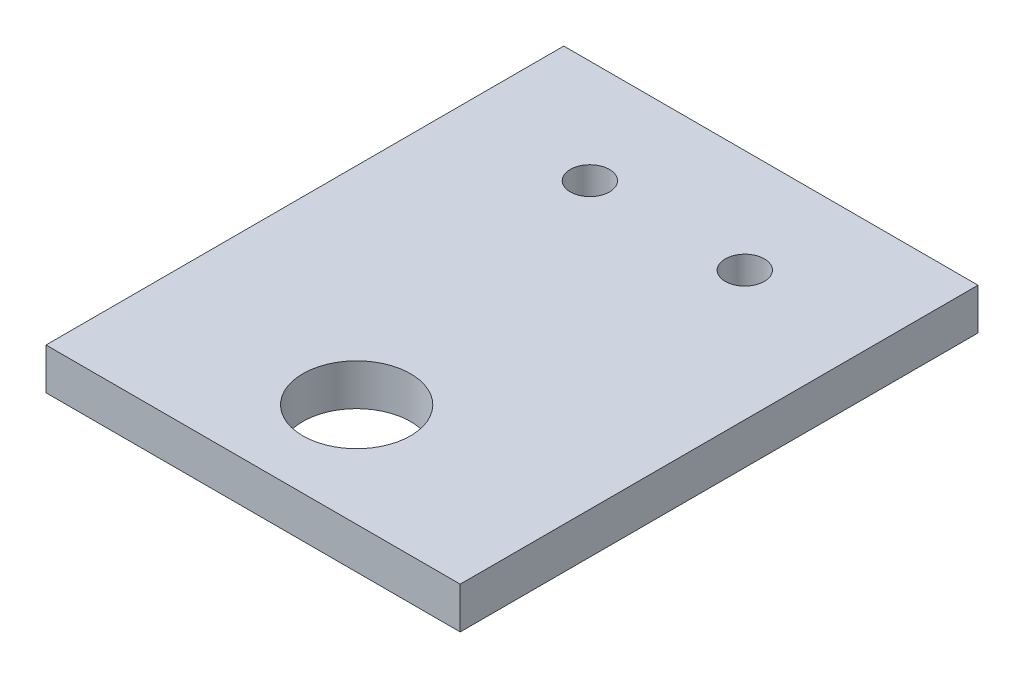
ISO-10303-21;
HEADER;
FILE_DESCRIPTION(('STEP AP214'),'2;1');
FILE_NAME('part.step','',(''),(''),'','','');
FILE_SCHEMA(('AUTOMOTIVE_DESIGN { 1 0 10303 214 1 1 1 1 }'));
ENDSEC;
DATA;
#1=APPLICATION_CONTEXT('core data for automotive mechanical design processes');
#2=APPLICATION_PROTOCOL_DEFINITION('international standard','automotive_design',2000,#1);
#3=PRODUCT_CONTEXT('',#1,'mechanical');
#4=PRODUCT('Part','Part','',(#3));
#5=PRODUCT_RELATED_PRODUCT_CATEGORY('part','',(#4));
#6=PRODUCT_DEFINITION_FORMATION('','',#4);
#7=PRODUCT_DEFINITION_CONTEXT('part definition',#1,'design');
#8=PRODUCT_DEFINITION('design','',#6,#7);
#9=PRODUCT_DEFINITION_SHAPE('','',#8);
#10=(LENGTH_UNIT() NAMED_UNIT(*) SI_UNIT(.MILLI.,.METRE.));
#11=(NAMED_UNIT(*) PLANE_ANGLE_UNIT() SI_UNIT($,.RADIAN.));
#12=(NAMED_UNIT(*) SI_UNIT($,.STERADIAN.) SOLID_ANGLE_UNIT());
#13=UNCERTAINTY_MEASURE_WITH_UNIT(LENGTH_MEASURE(1.E-05),#10,'distance_accuracy_value','');
#14=(GEOMETRIC_REPRESENTATION_CONTEXT(3) GLOBAL_UNCERTAINTY_ASSIGNED_CONTEXT((#13)) GLOBAL_UNIT_ASSIGNED_CONTEXT((#10,
#11,#12)) REPRESENTATION_CONTEXT('',''));
#15=CARTESIAN_POINT('',(0.,0.,0.));
#16=DIRECTION('',(0.,0.,1.));
#17=DIRECTION('',(1.,0.,0.));
#18=AXIS2_PLACEMENT_3D('',#15,#16,#17);
#19=CARTESIAN_POINT('',(-6.89428571428569,2.54,-7.16642857142856));
#20=DIRECTION('',(1.,0.,0.));
#21=DIRECTION('',(0.,0.,-1.));
#22=AXIS2_PLACEMENT_3D('',#19,#20,#21);
#23=PLANE('',#22);
#24=DIRECTION('',(0.,0.,1.));
#25=VECTOR('',#24,1.);
#26=CARTESIAN_POINT('',(-6.89428571428569,0.,-7.16642857142856));
#27=LINE('',#26,#25);
#28=CARTESIAN_POINT('',(-6.89428571428569,0.,-7.16642857142856));
#29=VERTEX_POINT('',#28);
#30=CARTESIAN_POINT('',(-6.89428571428568,0.,24.5835714285714));
#31=VERTEX_POINT('',#30);
#32=EDGE_CURVE('E98',#29,#31,#27,.T.);
#33=ORIENTED_EDGE('',*,*,#32,.T.);
#34=DIRECTION('',(0.,-1.,0.));
#35=VECTOR('',#34,1.);
#36=CARTESIAN_POINT('',(-6.89428571428568,2.54,24.5835714285714));
#37=LINE('',#36,#35);
#38=CARTESIAN_POINT('',(-6.89428571428568,2.54,24.5835714285714));
#39=VERTEX_POINT('',#38);
#40=EDGE_CURVE('E11',#39,#31,#37,.T.);
#41=ORIENTED_EDGE('',*,*,#40,.F.);
#42=DIRECTION('',(0.,0.,1.));
#43=VECTOR('',#42,1.);
#44=CARTESIAN_POINT('',(-6.89428571428569,2.54,-7.16642857142856));
#45=LINE('',#44,#43);
#46=CARTESIAN_POINT('',(-6.89428571428569,2.54,-7.16642857142856));
#47=VERTEX_POINT('',#46);
#48=EDGE_CURVE('E85',#47,#39,#45,.T.);
#49=ORIENTED_EDGE('',*,*,#48,.F.);
#50=DIRECTION('',(0.,-1.,0.));
#51=VECTOR('',#50,1.);
#52=CARTESIAN_POINT('',(-6.89428571428569,2.54,-7.16642857142856));
#53=LINE('',#52,#51);
#54=EDGE_CURVE('E94',#47,#29,#53,.T.);
#55=ORIENTED_EDGE('',*,*,#54,.T.);
#56=EDGE_LOOP('',(#33,#41,#49,#55));
#57=FACE_BOUND('',#56,.T.);
#58=ADVANCED_FACE('F33',(#57),#23,.F.);
#59=CARTESIAN_POINT('',(-6.89428571428568,2.54,24.5835714285714));
#60=DIRECTION('',(0.,0.,-1.));
#61=DIRECTION('',(-1.,0.,0.));
#62=AXIS2_PLACEMENT_3D('',#59,#60,#61);
#63=PLANE('',#62);
#64=DIRECTION('',(1.,0.,0.));
#65=VECTOR('',#64,1.);
#66=CARTESIAN_POINT('',(-6.89428571428568,0.,24.5835714285714));
#67=LINE('',#66,#65);
#68=CARTESIAN_POINT('',(18.5057142857143,0.,24.5835714285714));
#69=VERTEX_POINT('',#68);
#70=EDGE_CURVE('E89',#31,#69,#67,.T.);
#71=ORIENTED_EDGE('',*,*,#70,.T.);
#72=DIRECTION('',(0.,-1.,0.));
#73=VECTOR('',#72,1.);
#74=CARTESIAN_POINT('',(18.5057142857143,2.54,24.5835714285714));
#75=LINE('',#74,#73);
#76=CARTESIAN_POINT('',(18.5057142857143,2.54,24.5835714285714));
#77=VERTEX_POINT('',#76);
#78=EDGE_CURVE('E42',#77,#69,#75,.T.);
#79=ORIENTED_EDGE('',*,*,#78,.F.);
#80=DIRECTION('',(1.,0.,0.));
#81=VECTOR('',#80,1.);
#82=CARTESIAN_POINT('',(-6.89428571428568,2.54,24.5835714285714));
#83=LINE('',#82,#81);
#84=EDGE_CURVE('E80',#39,#77,#83,.T.);
#85=ORIENTED_EDGE('',*,*,#84,.F.);
#86=ORIENTED_EDGE('',*,*,#40,.T.);
#87=EDGE_LOOP('',(#71,#79,#85,#86));
#88=FACE_BOUND('',#87,.T.);
#89=ADVANCED_FACE('F88',(#88),#63,.F.);
#90=CARTESIAN_POINT('',(18.5057142857143,2.54,-7.16642857142856));
#91=DIRECTION('',(-1.,0.,0.));
#92=DIRECTION('',(0.,0.,1.));
#93=AXIS2_PLACEMENT_3D('',#90,#91,#92);
#94=PLANE('',#93);
#95=DIRECTION('',(0.,0.,-1.));
#96=VECTOR('',#95,1.);
#97=CARTESIAN_POINT('',(18.5057142857143,0.,-7.16642857142856));
#98=LINE('',#97,#96);
#99=CARTESIAN_POINT('',(18.5057142857143,0.,-7.16642857142856));
#100=VERTEX_POINT('',#99);
#101=EDGE_CURVE('E67',#69,#100,#98,.T.);
#102=ORIENTED_EDGE('',*,*,#101,.T.);
#103=DIRECTION('',(0.,-1.,0.));
#104=VECTOR('',#103,1.);
#105=CARTESIAN_POINT('',(18.5057142857143,2.54,-7.16642857142856));
#106=LINE('',#105,#104);
#107=CARTESIAN_POINT('',(18.5057142857143,2.54,-7.16642857142856));
#108=VERTEX_POINT('',#107);
#109=EDGE_CURVE('E90',#108,#100,#106,.T.);
#110=ORIENTED_EDGE('',*,*,#109,.F.);
#111=DIRECTION('',(0.,0.,-1.));
#112=VECTOR('',#111,1.);
#113=CARTESIAN_POINT('',(18.5057142857143,2.54,-7.16642857142856));
#114=LINE('',#113,#112);
#115=EDGE_CURVE('E83',#77,#108,#114,.T.);
#116=ORIENTED_EDGE('',*,*,#115,.F.);
#117=ORIENTED_EDGE('',*,*,#78,.T.);
#118=EDGE_LOOP('',(#102,#110,#116,#117));
#119=FACE_BOUND('',#118,.T.);
#120=ADVANCED_FACE('F92',(#119),#94,.F.);
#121=CARTESIAN_POINT('',(-6.89428571428569,2.54,-7.16642857142856));
#122=DIRECTION('',(0.,0.,1.));
#123=DIRECTION('',(1.,0.,0.));
#124=AXIS2_PLACEMENT_3D('',#121,#122,#123);
#125=PLANE('',#124);
#126=DIRECTION('',(-1.,0.,0.));
#127=VECTOR('',#126,1.);
#128=CARTESIAN_POINT('',(-6.89428571428569,0.,-7.16642857142856));
#129=LINE('',#128,#127);
#130=EDGE_CURVE('E73',#100,#29,#129,.T.);
#131=ORIENTED_EDGE('',*,*,#130,.T.);
#132=ORIENTED_EDGE('',*,*,#54,.F.);
#133=DIRECTION('',(-1.,0.,0.));
#134=VECTOR('',#133,1.);
#135=CARTESIAN_POINT('',(-6.89428571428569,2.54,-7.16642857142856));
#136=LINE('',#135,#134);
#137=EDGE_CURVE('E50',#108,#47,#136,.T.);
#138=ORIENTED_EDGE('',*,*,#137,.F.);
#139=ORIENTED_EDGE('',*,*,#109,.T.);
#140=EDGE_LOOP('',(#131,#132,#138,#139));
#141=FACE_BOUND('',#140,.T.);
#142=ADVANCED_FACE('F106',(#141),#125,.F.);
#143=CARTESIAN_POINT('',(0.,2.54,0.));
#144=DIRECTION('',(0.,1.,0.));
#145=DIRECTION('',(0.,0.,1.));
#146=AXIS2_PLACEMENT_3D('',#143,#144,#145);
#147=PLANE('',#146);
#148=CARTESIAN_POINT('',(5.80571428571432,2.54,18.2335714285714));
#149=DIRECTION('',(0.,1.,0.));
#150=DIRECTION('',(0.,0.,1.));
#151=AXIS2_PLACEMENT_3D('',#148,#149,#150);
#152=CIRCLE('',#151,3.302);
#153=CARTESIAN_POINT('',(5.80571428571432,2.54,21.5355714285714));
#154=VERTEX_POINT('',#153);
#155=EDGE_CURVE('E123',#154,#154,#152,.T.);
#156=ORIENTED_EDGE('',*,*,#155,.F.);
#157=EDGE_LOOP('',(#156));
#158=FACE_BOUND('',#157,.T.);
#159=CARTESIAN_POINT('',(1.05571428571432,2.54,-0.816428571428562));
#160=DIRECTION('',(0.,1.,0.));
#161=DIRECTION('',(0.,0.,1.));
#162=AXIS2_PLACEMENT_3D('',#159,#160,#161);
#163=CIRCLE('',#162,1.19999999999999);
#164=CARTESIAN_POINT('',(1.05571428571432,2.54,0.383571428571425));
#165=VERTEX_POINT('',#164);
#166=EDGE_CURVE('E120',#165,#165,#163,.T.);
#167=ORIENTED_EDGE('',*,*,#166,.F.);
#168=EDGE_LOOP('',(#167));
#169=FACE_BOUND('',#168,.T.);
#170=CARTESIAN_POINT('',(10.5557142857143,2.54,-0.816428571428562));
#171=DIRECTION('',(0.,1.,0.));
#172=DIRECTION('',(0.,0.,1.));
#173=AXIS2_PLACEMENT_3D('',#170,#171,#172);
#174=CIRCLE('',#173,1.19999999999999);
#175=CARTESIAN_POINT('',(10.5557142857143,2.54,0.383571428571425));
#176=VERTEX_POINT('',#175);
#177=EDGE_CURVE('E114',#176,#176,#174,.T.);
#178=ORIENTED_EDGE('',*,*,#177,.F.);
#179=EDGE_LOOP('',(#178));
#180=FACE_BOUND('',#179,.T.);
#181=ORIENTED_EDGE('',*,*,#48,.T.);
#182=ORIENTED_EDGE('',*,*,#84,.T.);
#183=ORIENTED_EDGE('',*,*,#115,.T.);
#184=ORIENTED_EDGE('',*,*,#137,.T.);
#185=EDGE_LOOP('',(#181,#182,#183,#184));
#186=FACE_BOUND('',#185,.T.);
#187=ADVANCED_FACE('F81',(#158,#169,#180,#186),#147,.T.);
#188=CARTESIAN_POINT('',(0.,0.,0.));
#189=DIRECTION('',(0.,1.,0.));
#190=DIRECTION('',(0.,0.,1.));
#191=AXIS2_PLACEMENT_3D('',#188,#189,#190);
#192=PLANE('',#191);
#193=CARTESIAN_POINT('',(5.80571428571432,0.,18.2335714285714));
#194=DIRECTION('',(0.,1.,0.));
#195=DIRECTION('',(0.,0.,1.));
#196=AXIS2_PLACEMENT_3D('',#193,#194,#195);
#197=CIRCLE('',#196,3.302);
#198=CARTESIAN_POINT('',(5.80571428571432,0.,21.5355714285714));
#199=VERTEX_POINT('',#198);
#200=EDGE_CURVE('E36',#199,#199,#197,.T.);
#201=ORIENTED_EDGE('',*,*,#200,.T.);
#202=EDGE_LOOP('',(#201));
#203=FACE_BOUND('',#202,.T.);
#204=CARTESIAN_POINT('',(1.05571428571432,0.,-0.816428571428562));
#205=DIRECTION('',(0.,1.,0.));
#206=DIRECTION('',(0.,0.,1.));
#207=AXIS2_PLACEMENT_3D('',#204,#205,#206);
#208=CIRCLE('',#207,1.2);
#209=CARTESIAN_POINT('',(1.05571428571432,0.,0.383571428571437));
#210=VERTEX_POINT('',#209);
#211=EDGE_CURVE('E117',#210,#210,#208,.T.);
#212=ORIENTED_EDGE('',*,*,#211,.T.);
#213=EDGE_LOOP('',(#212));
#214=FACE_BOUND('',#213,.T.);
#215=CARTESIAN_POINT('',(10.5557142857143,0.,-0.816428571428562));
#216=DIRECTION('',(0.,1.,0.));
#217=DIRECTION('',(0.,0.,1.));
#218=AXIS2_PLACEMENT_3D('',#215,#216,#217);
#219=CIRCLE('',#218,1.2);
#220=CARTESIAN_POINT('',(10.5557142857143,0.,0.383571428571438));
#221=VERTEX_POINT('',#220);
#222=EDGE_CURVE('E101',#221,#221,#219,.T.);
#223=ORIENTED_EDGE('',*,*,#222,.T.);
#224=EDGE_LOOP('',(#223));
#225=FACE_BOUND('',#224,.T.);
#226=ORIENTED_EDGE('',*,*,#32,.F.);
#227=ORIENTED_EDGE('',*,*,#130,.F.);
#228=ORIENTED_EDGE('',*,*,#101,.F.);
#229=ORIENTED_EDGE('',*,*,#70,.F.);
#230=EDGE_LOOP('',(#226,#227,#228,#229));
#231=FACE_BOUND('',#230,.T.);
#232=ADVANCED_FACE('F109',(#203,#214,#225,#231),#192,.F.);
#233=CARTESIAN_POINT('',(10.5557142857143,2.54,-0.816428571428562));
#234=DIRECTION('',(0.,1.,0.));
#235=DIRECTION('',(0.,0.,1.));
#236=AXIS2_PLACEMENT_3D('',#233,#234,#235);
#237=CYLINDRICAL_SURFACE('',#236,1.19999999999999);
#238=ORIENTED_EDGE('',*,*,#222,.F.);
#239=EDGE_LOOP('',(#238));
#240=FACE_BOUND('',#239,.T.);
#241=ORIENTED_EDGE('',*,*,#177,.T.);
#242=EDGE_LOOP('',(#241));
#243=FACE_BOUND('',#242,.T.);
#244=ADVANCED_FACE('F139',(#240,#243),#237,.F.);
#245=CARTESIAN_POINT('',(1.05571428571432,2.54,-0.816428571428562));
#246=DIRECTION('',(0.,1.,0.));
#247=DIRECTION('',(0.,0.,1.));
#248=AXIS2_PLACEMENT_3D('',#245,#246,#247);
#249=CYLINDRICAL_SURFACE('',#248,1.19999999999999);
#250=ORIENTED_EDGE('',*,*,#211,.F.);
#251=EDGE_LOOP('',(#250));
#252=FACE_BOUND('',#251,.T.);
#253=ORIENTED_EDGE('',*,*,#166,.T.);
#254=EDGE_LOOP('',(#253));
#255=FACE_BOUND('',#254,.T.);
#256=ADVANCED_FACE('F134',(#252,#255),#249,.F.);
#257=CARTESIAN_POINT('',(5.80571428571432,-0.635,18.2335714285714));
#258=DIRECTION('',(0.,1.,0.));
#259=DIRECTION('',(0.,0.,1.));
#260=AXIS2_PLACEMENT_3D('',#257,#258,#259);
#261=CYLINDRICAL_SURFACE('',#260,3.302);
#262=ORIENTED_EDGE('',*,*,#155,.T.);
#263=EDGE_LOOP('',(#262));
#264=FACE_BOUND('',#263,.T.);
#265=ORIENTED_EDGE('',*,*,#200,.F.);
#266=EDGE_LOOP('',(#265));
#267=FACE_BOUND('',#266,.T.);
#268=ADVANCED_FACE('F132',(#264,#267),#261,.F.);
#269=CLOSED_SHELL('',(#58,#89,#120,#142,#187,#232,#244,#256,#268));
#270=MANIFOLD_SOLID_BREP('B2',#269);
#271=ADVANCED_BREP_SHAPE_REPRESENTATION('',(#18,#270),#14);
#272=SHAPE_DEFINITION_REPRESENTATION(#9,#271);
ENDSEC;
END-ISO-10303-21;
